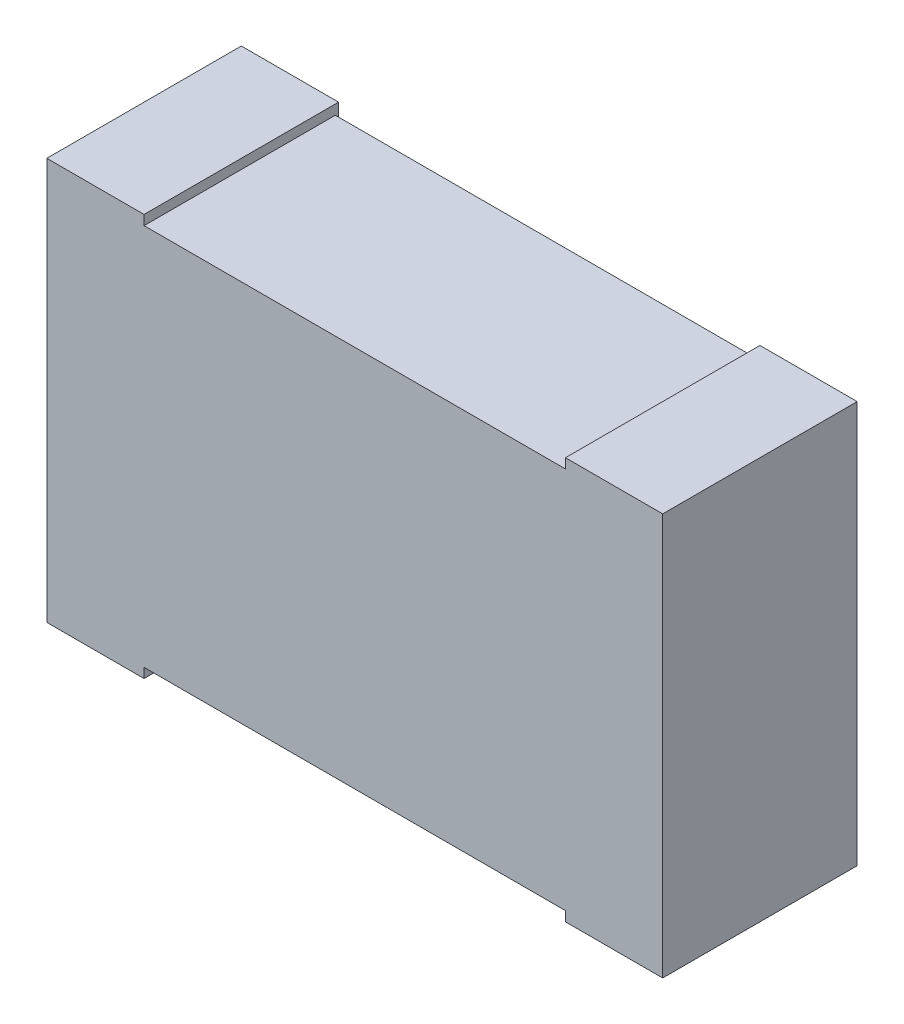
ISO-10303-21;
HEADER;
FILE_DESCRIPTION(('STEP AP214'),'2;1');
FILE_NAME('part.step','',(''),(''),'','','');
FILE_SCHEMA(('AUTOMOTIVE_DESIGN { 1 0 10303 214 1 1 1 1 }'));
ENDSEC;
DATA;
#1=APPLICATION_CONTEXT('core data for automotive mechanical design processes');
#2=APPLICATION_PROTOCOL_DEFINITION('international standard','automotive_design',2000,#1);
#3=PRODUCT_CONTEXT('',#1,'mechanical');
#4=PRODUCT('Part','Part','',(#3));
#5=PRODUCT_RELATED_PRODUCT_CATEGORY('part','',(#4));
#6=PRODUCT_DEFINITION_FORMATION('','',#4);
#7=PRODUCT_DEFINITION_CONTEXT('part definition',#1,'design');
#8=PRODUCT_DEFINITION('design','',#6,#7);
#9=PRODUCT_DEFINITION_SHAPE('','',#8);
#10=(LENGTH_UNIT() NAMED_UNIT(*) SI_UNIT(.MILLI.,.METRE.));
#11=(NAMED_UNIT(*) PLANE_ANGLE_UNIT() SI_UNIT($,.RADIAN.));
#12=(NAMED_UNIT(*) SI_UNIT($,.STERADIAN.) SOLID_ANGLE_UNIT());
#13=UNCERTAINTY_MEASURE_WITH_UNIT(LENGTH_MEASURE(1.E-05),#10,'distance_accuracy_value','');
#14=(GEOMETRIC_REPRESENTATION_CONTEXT(3) GLOBAL_UNCERTAINTY_ASSIGNED_CONTEXT((#13)) GLOBAL_UNIT_ASSIGNED_CONTEXT((#10,
#11,#12)) REPRESENTATION_CONTEXT('',''));
#15=CARTESIAN_POINT('',(0.,0.,0.));
#16=DIRECTION('',(0.,0.,1.));
#17=DIRECTION('',(1.,0.,0.));
#18=AXIS2_PLACEMENT_3D('',#15,#16,#17);
#19=CARTESIAN_POINT('',(-11.442010069563,-2.8790983561611,-0.6));
#20=DIRECTION('',(0.,0.,-1.));
#21=DIRECTION('',(-1.,0.,0.));
#22=AXIS2_PLACEMENT_3D('',#19,#20,#21);
#23=PLANE('',#22);
#24=DIRECTION('',(0.,1.,0.));
#25=VECTOR('',#24,1.);
#26=CARTESIAN_POINT('',(-12.392010069563,-3.4990983561611,-0.6));
#27=LINE('',#26,#25);
#28=CARTESIAN_POINT('',(-12.392010069563,-2.2590983561611,-0.6));
#29=VERTEX_POINT('',#28);
#30=CARTESIAN_POINT('',(-12.392010069563,-3.4990983561611,-0.6));
#31=VERTEX_POINT('',#30);
#32=EDGE_CURVE('E102',#29,#31,#27,.F.);
#33=ORIENTED_EDGE('',*,*,#32,.F.);
#34=DIRECTION('',(1.,0.,0.));
#35=VECTOR('',#34,1.);
#36=CARTESIAN_POINT('',(-12.392010069563,-2.2590983561611,-0.6));
#37=LINE('',#36,#35);
#38=CARTESIAN_POINT('',(-12.092010069563,-2.2590983561611,-0.6));
#39=VERTEX_POINT('',#38);
#40=EDGE_CURVE('E107',#39,#29,#37,.F.);
#41=ORIENTED_EDGE('',*,*,#40,.F.);
#42=DIRECTION('',(0.,1.,0.));
#43=VECTOR('',#42,1.);
#44=CARTESIAN_POINT('',(-12.092010069563,-3.4690983561611,-0.6));
#45=LINE('',#44,#43);
#46=CARTESIAN_POINT('',(-12.092010069563,-3.4990983561611,-0.6));
#47=VERTEX_POINT('',#46);
#48=EDGE_CURVE('E131',#47,#39,#45,.T.);
#49=ORIENTED_EDGE('',*,*,#48,.F.);
#50=DIRECTION('',(1.,0.,0.));
#51=VECTOR('',#50,1.);
#52=CARTESIAN_POINT('',(-12.092010069563,-3.4990983561611,-0.6));
#53=LINE('',#52,#51);
#54=EDGE_CURVE('E116',#31,#47,#53,.T.);
#55=ORIENTED_EDGE('',*,*,#54,.F.);
#56=EDGE_LOOP('',(#33,#41,#49,#55));
#57=FACE_BOUND('',#56,.T.);
#58=ADVANCED_FACE('F16',(#57),#23,.T.);
#59=CARTESIAN_POINT('',(-11.442010069563,-2.8790983561611,-0.59));
#60=DIRECTION('',(0.,0.,1.));
#61=DIRECTION('',(1.,0.,0.));
#62=AXIS2_PLACEMENT_3D('',#59,#60,#61);
#63=PLANE('',#62);
#64=DIRECTION('',(0.,1.,0.));
#65=VECTOR('',#64,1.);
#66=CARTESIAN_POINT('',(-10.792010069563,-3.4990983561611,-0.59));
#67=LINE('',#66,#65);
#68=CARTESIAN_POINT('',(-10.792010069563,-3.4690983561611,-0.59));
#69=VERTEX_POINT('',#68);
#70=CARTESIAN_POINT('',(-10.792010069563,-2.2890983561611,-0.59));
#71=VERTEX_POINT('',#70);
#72=EDGE_CURVE('E160',#69,#71,#67,.T.);
#73=ORIENTED_EDGE('',*,*,#72,.F.);
#74=DIRECTION('',(1.,0.,0.));
#75=VECTOR('',#74,1.);
#76=CARTESIAN_POINT('',(-10.792010069563,-3.4690983561611,-0.59));
#77=LINE('',#76,#75);
#78=CARTESIAN_POINT('',(-12.092010069563,-3.4690983561611,-0.59));
#79=VERTEX_POINT('',#78);
#80=EDGE_CURVE('E140',#79,#69,#77,.T.);
#81=ORIENTED_EDGE('',*,*,#80,.F.);
#82=DIRECTION('',(0.,1.,0.));
#83=VECTOR('',#82,1.);
#84=CARTESIAN_POINT('',(-12.092010069563,-3.4690983561611,-0.59));
#85=LINE('',#84,#83);
#86=CARTESIAN_POINT('',(-12.092010069563,-2.2890983561611,-0.59));
#87=VERTEX_POINT('',#86);
#88=EDGE_CURVE('E137',#87,#79,#85,.F.);
#89=ORIENTED_EDGE('',*,*,#88,.F.);
#90=DIRECTION('',(1.,0.,0.));
#91=VECTOR('',#90,1.);
#92=CARTESIAN_POINT('',(-12.092010069563,-2.2890983561611,-0.59));
#93=LINE('',#92,#91);
#94=EDGE_CURVE('E19',#71,#87,#93,.F.);
#95=ORIENTED_EDGE('',*,*,#94,.F.);
#96=EDGE_LOOP('',(#73,#81,#89,#95));
#97=FACE_BOUND('',#96,.T.);
#98=ADVANCED_FACE('F333',(#97),#63,.F.);
#99=CARTESIAN_POINT('',(-11.442010069563,-2.8790983561611,-0.6));
#100=DIRECTION('',(0.,0.,-1.));
#101=DIRECTION('',(-1.,0.,0.));
#102=AXIS2_PLACEMENT_3D('',#99,#100,#101);
#103=PLANE('',#102);
#104=DIRECTION('',(0.,1.,0.));
#105=VECTOR('',#104,1.);
#106=CARTESIAN_POINT('',(-10.492010069563,-2.2590983561611,-0.6));
#107=LINE('',#106,#105);
#108=CARTESIAN_POINT('',(-10.492010069563,-3.4990983561611,-0.6));
#109=VERTEX_POINT('',#108);
#110=CARTESIAN_POINT('',(-10.492010069563,-2.2590983561611,-0.6));
#111=VERTEX_POINT('',#110);
#112=EDGE_CURVE('E150',#109,#111,#107,.T.);
#113=ORIENTED_EDGE('',*,*,#112,.F.);
#114=DIRECTION('',(1.,0.,0.));
#115=VECTOR('',#114,1.);
#116=CARTESIAN_POINT('',(-10.492010069563,-3.4990983561611,-0.6));
#117=LINE('',#116,#115);
#118=CARTESIAN_POINT('',(-10.792010069563,-3.4990983561611,-0.6));
#119=VERTEX_POINT('',#118);
#120=EDGE_CURVE('E145',#119,#109,#117,.T.);
#121=ORIENTED_EDGE('',*,*,#120,.F.);
#122=DIRECTION('',(0.,1.,0.));
#123=VECTOR('',#122,1.);
#124=CARTESIAN_POINT('',(-10.792010069563,-3.4990983561611,-0.6));
#125=LINE('',#124,#123);
#126=CARTESIAN_POINT('',(-10.792010069563,-2.2590983561611,-0.6));
#127=VERTEX_POINT('',#126);
#128=EDGE_CURVE('E167',#127,#119,#125,.F.);
#129=ORIENTED_EDGE('',*,*,#128,.F.);
#130=DIRECTION('',(1.,0.,0.));
#131=VECTOR('',#130,1.);
#132=CARTESIAN_POINT('',(-10.792010069563,-2.2590983561611,-0.6));
#133=LINE('',#132,#131);
#134=EDGE_CURVE('E155',#111,#127,#133,.F.);
#135=ORIENTED_EDGE('',*,*,#134,.F.);
#136=EDGE_LOOP('',(#113,#121,#129,#135));
#137=FACE_BOUND('',#136,.T.);
#138=ADVANCED_FACE('F210',(#137),#103,.T.);
#139=CARTESIAN_POINT('',(-12.092010069563,-2.2890983561611,0.));
#140=DIRECTION('',(0.,1.,0.));
#141=DIRECTION('',(0.,0.,1.));
#142=AXIS2_PLACEMENT_3D('',#139,#140,#141);
#143=PLANE('',#142);
#144=DIRECTION('',(1.,0.,0.));
#145=VECTOR('',#144,1.);
#146=CARTESIAN_POINT('',(-11.442010069563,-2.2890983561611,0.));
#147=LINE('',#146,#145);
#148=CARTESIAN_POINT('',(-10.792010069563,-2.2890983561611,0.));
#149=VERTEX_POINT('',#148);
#150=CARTESIAN_POINT('',(-12.092010069563,-2.2890983561611,0.));
#151=VERTEX_POINT('',#150);
#152=EDGE_CURVE('E172',#149,#151,#147,.F.);
#153=ORIENTED_EDGE('',*,*,#152,.F.);
#154=DIRECTION('',(0.,0.,1.));
#155=VECTOR('',#154,1.);
#156=CARTESIAN_POINT('',(-10.792010069563,-2.2890983561611,0.));
#157=LINE('',#156,#155);
#158=EDGE_CURVE('E163',#71,#149,#157,.T.);
#159=ORIENTED_EDGE('',*,*,#158,.F.);
#160=ORIENTED_EDGE('',*,*,#94,.T.);
#161=DIRECTION('',(0.,0.,-1.));
#162=VECTOR('',#161,1.);
#163=CARTESIAN_POINT('',(-12.092010069563,-2.2890983561611,0.));
#164=LINE('',#163,#162);
#165=EDGE_CURVE('E134',#151,#87,#164,.T.);
#166=ORIENTED_EDGE('',*,*,#165,.F.);
#167=EDGE_LOOP('',(#153,#159,#160,#166));
#168=FACE_BOUND('',#167,.T.);
#169=ADVANCED_FACE('F217',(#168),#143,.T.);
#170=CARTESIAN_POINT('',(-12.392010069563,-2.2590983561611,0.));
#171=DIRECTION('',(0.,1.,0.));
#172=DIRECTION('',(0.,0.,1.));
#173=AXIS2_PLACEMENT_3D('',#170,#171,#172);
#174=PLANE('',#173);
#175=ORIENTED_EDGE('',*,*,#40,.T.);
#176=DIRECTION('',(0.,0.,1.));
#177=VECTOR('',#176,1.);
#178=CARTESIAN_POINT('',(-12.392010069563,-2.2590983561611,0.));
#179=LINE('',#178,#177);
#180=CARTESIAN_POINT('',(-12.392010069563,-2.2590983561611,0.));
#181=VERTEX_POINT('',#180);
#182=EDGE_CURVE('E110',#181,#29,#179,.F.);
#183=ORIENTED_EDGE('',*,*,#182,.F.);
#184=DIRECTION('',(1.,0.,0.));
#185=VECTOR('',#184,1.);
#186=CARTESIAN_POINT('',(-11.442010069563,-2.2590983561611,0.));
#187=LINE('',#186,#185);
#188=CARTESIAN_POINT('',(-12.092010069563,-2.2590983561611,0.));
#189=VERTEX_POINT('',#188);
#190=EDGE_CURVE('E178',#189,#181,#187,.F.);
#191=ORIENTED_EDGE('',*,*,#190,.F.);
#192=DIRECTION('',(0.,0.,-1.));
#193=VECTOR('',#192,1.);
#194=CARTESIAN_POINT('',(-12.092010069563,-2.2590983561611,0.));
#195=LINE('',#194,#193);
#196=EDGE_CURVE('E112',#39,#189,#195,.F.);
#197=ORIENTED_EDGE('',*,*,#196,.F.);
#198=EDGE_LOOP('',(#175,#183,#191,#197));
#199=FACE_BOUND('',#198,.T.);
#200=ADVANCED_FACE('F108',(#199),#174,.T.);
#201=CARTESIAN_POINT('',(-12.392010069563,-3.4990983561611,0.));
#202=DIRECTION('',(-1.,0.,0.));
#203=DIRECTION('',(0.,0.,1.));
#204=AXIS2_PLACEMENT_3D('',#201,#202,#203);
#205=PLANE('',#204);
#206=ORIENTED_EDGE('',*,*,#32,.T.);
#207=DIRECTION('',(0.,0.,-1.));
#208=VECTOR('',#207,1.);
#209=CARTESIAN_POINT('',(-12.392010069563,-3.4990983561611,0.));
#210=LINE('',#209,#208);
#211=CARTESIAN_POINT('',(-12.392010069563,-3.4990983561611,0.));
#212=VERTEX_POINT('',#211);
#213=EDGE_CURVE('E118',#212,#31,#210,.T.);
#214=ORIENTED_EDGE('',*,*,#213,.F.);
#215=DIRECTION('',(0.,1.,0.));
#216=VECTOR('',#215,1.);
#217=CARTESIAN_POINT('',(-12.392010069563,-2.8790983561611,0.));
#218=LINE('',#217,#216);
#219=EDGE_CURVE('E122',#181,#212,#218,.F.);
#220=ORIENTED_EDGE('',*,*,#219,.F.);
#221=ORIENTED_EDGE('',*,*,#182,.T.);
#222=EDGE_LOOP('',(#206,#214,#220,#221));
#223=FACE_BOUND('',#222,.T.);
#224=ADVANCED_FACE('F120',(#223),#205,.T.);
#225=CARTESIAN_POINT('',(-12.092010069563,-3.4990983561611,0.));
#226=DIRECTION('',(0.,-1.,0.));
#227=DIRECTION('',(0.,0.,-1.));
#228=AXIS2_PLACEMENT_3D('',#225,#226,#227);
#229=PLANE('',#228);
#230=ORIENTED_EDGE('',*,*,#54,.T.);
#231=DIRECTION('',(0.,0.,-1.));
#232=VECTOR('',#231,1.);
#233=CARTESIAN_POINT('',(-12.092010069563,-3.4990983561611,0.));
#234=LINE('',#233,#232);
#235=CARTESIAN_POINT('',(-12.092010069563,-3.4990983561611,0.));
#236=VERTEX_POINT('',#235);
#237=EDGE_CURVE('E128',#236,#47,#234,.T.);
#238=ORIENTED_EDGE('',*,*,#237,.F.);
#239=DIRECTION('',(1.,0.,0.));
#240=VECTOR('',#239,1.);
#241=CARTESIAN_POINT('',(-11.442010069563,-3.4990983561611,0.));
#242=LINE('',#241,#240);
#243=EDGE_CURVE('E181',#212,#236,#242,.T.);
#244=ORIENTED_EDGE('',*,*,#243,.F.);
#245=ORIENTED_EDGE('',*,*,#213,.T.);
#246=EDGE_LOOP('',(#230,#238,#244,#245));
#247=FACE_BOUND('',#246,.T.);
#248=ADVANCED_FACE('F225',(#247),#229,.T.);
#249=CARTESIAN_POINT('',(-12.092010069563,-3.4690983561611,0.));
#250=DIRECTION('',(1.,0.,0.));
#251=DIRECTION('',(0.,0.,-1.));
#252=AXIS2_PLACEMENT_3D('',#249,#250,#251);
#253=PLANE('',#252);
#254=ORIENTED_EDGE('',*,*,#88,.T.);
#255=DIRECTION('',(0.,0.,-1.));
#256=VECTOR('',#255,1.);
#257=CARTESIAN_POINT('',(-12.092010069563,-3.4690983561611,0.));
#258=LINE('',#257,#256);
#259=CARTESIAN_POINT('',(-12.092010069563,-3.4690983561611,0.));
#260=VERTEX_POINT('',#259);
#261=EDGE_CURVE('E142',#260,#79,#258,.T.);
#262=ORIENTED_EDGE('',*,*,#261,.F.);
#263=DIRECTION('',(0.,1.,0.));
#264=VECTOR('',#263,1.);
#265=CARTESIAN_POINT('',(-12.092010069563,-2.8790983561611,0.));
#266=LINE('',#265,#264);
#267=EDGE_CURVE('E184',#236,#260,#266,.T.);
#268=ORIENTED_EDGE('',*,*,#267,.F.);
#269=ORIENTED_EDGE('',*,*,#237,.T.);
#270=ORIENTED_EDGE('',*,*,#48,.T.);
#271=ORIENTED_EDGE('',*,*,#196,.T.);
#272=DIRECTION('',(0.,1.,0.));
#273=VECTOR('',#272,1.);
#274=CARTESIAN_POINT('',(-12.092010069563,-2.8790983561611,0.));
#275=LINE('',#274,#273);
#276=EDGE_CURVE('E175',#151,#189,#275,.T.);
#277=ORIENTED_EDGE('',*,*,#276,.F.);
#278=ORIENTED_EDGE('',*,*,#165,.T.);
#279=EDGE_LOOP('',(#254,#262,#268,#269,#270,#271,#277,#278));
#280=FACE_BOUND('',#279,.T.);
#281=ADVANCED_FACE('F221',(#280),#253,.T.);
#282=CARTESIAN_POINT('',(-10.792010069563,-3.4690983561611,0.));
#283=DIRECTION('',(0.,-1.,0.));
#284=DIRECTION('',(0.,0.,-1.));
#285=AXIS2_PLACEMENT_3D('',#282,#283,#284);
#286=PLANE('',#285);
#287=DIRECTION('',(1.,0.,0.));
#288=VECTOR('',#287,1.);
#289=CARTESIAN_POINT('',(-11.442010069563,-3.4690983561611,0.));
#290=LINE('',#289,#288);
#291=CARTESIAN_POINT('',(-10.792010069563,-3.4690983561611,0.));
#292=VERTEX_POINT('',#291);
#293=EDGE_CURVE('E187',#260,#292,#290,.T.);
#294=ORIENTED_EDGE('',*,*,#293,.F.);
#295=ORIENTED_EDGE('',*,*,#261,.T.);
#296=ORIENTED_EDGE('',*,*,#80,.T.);
#297=DIRECTION('',(0.,0.,1.));
#298=VECTOR('',#297,1.);
#299=CARTESIAN_POINT('',(-10.792010069563,-3.4690983561611,0.));
#300=LINE('',#299,#298);
#301=EDGE_CURVE('E157',#292,#69,#300,.F.);
#302=ORIENTED_EDGE('',*,*,#301,.F.);
#303=EDGE_LOOP('',(#294,#295,#296,#302));
#304=FACE_BOUND('',#303,.T.);
#305=ADVANCED_FACE('F229',(#304),#286,.T.);
#306=CARTESIAN_POINT('',(-10.492010069563,-3.4990983561611,0.));
#307=DIRECTION('',(0.,-1.,0.));
#308=DIRECTION('',(0.,0.,-1.));
#309=AXIS2_PLACEMENT_3D('',#306,#307,#308);
#310=PLANE('',#309);
#311=ORIENTED_EDGE('',*,*,#120,.T.);
#312=DIRECTION('',(0.,0.,-1.));
#313=VECTOR('',#312,1.);
#314=CARTESIAN_POINT('',(-10.492010069563,-3.4990983561611,0.));
#315=LINE('',#314,#313);
#316=CARTESIAN_POINT('',(-10.492010069563,-3.4990983561611,0.));
#317=VERTEX_POINT('',#316);
#318=EDGE_CURVE('E147',#317,#109,#315,.T.);
#319=ORIENTED_EDGE('',*,*,#318,.F.);
#320=DIRECTION('',(1.,0.,0.));
#321=VECTOR('',#320,1.);
#322=CARTESIAN_POINT('',(-11.442010069563,-3.4990983561611,0.));
#323=LINE('',#322,#321);
#324=CARTESIAN_POINT('',(-10.792010069563,-3.4990983561611,0.));
#325=VERTEX_POINT('',#324);
#326=EDGE_CURVE('E193',#325,#317,#323,.T.);
#327=ORIENTED_EDGE('',*,*,#326,.F.);
#328=DIRECTION('',(0.,0.,1.));
#329=VECTOR('',#328,1.);
#330=CARTESIAN_POINT('',(-10.792010069563,-3.4990983561611,0.));
#331=LINE('',#330,#329);
#332=EDGE_CURVE('E170',#119,#325,#331,.T.);
#333=ORIENTED_EDGE('',*,*,#332,.F.);
#334=EDGE_LOOP('',(#311,#319,#327,#333));
#335=FACE_BOUND('',#334,.T.);
#336=ADVANCED_FACE('F232',(#335),#310,.T.);
#337=CARTESIAN_POINT('',(-10.492010069563,-2.2590983561611,0.));
#338=DIRECTION('',(1.,0.,0.));
#339=DIRECTION('',(0.,0.,-1.));
#340=AXIS2_PLACEMENT_3D('',#337,#338,#339);
#341=PLANE('',#340);
#342=ORIENTED_EDGE('',*,*,#112,.T.);
#343=DIRECTION('',(0.,0.,1.));
#344=VECTOR('',#343,1.);
#345=CARTESIAN_POINT('',(-10.492010069563,-2.2590983561611,0.));
#346=LINE('',#345,#344);
#347=CARTESIAN_POINT('',(-10.492010069563,-2.2590983561611,0.));
#348=VERTEX_POINT('',#347);
#349=EDGE_CURVE('E152',#348,#111,#346,.F.);
#350=ORIENTED_EDGE('',*,*,#349,.F.);
#351=DIRECTION('',(0.,1.,0.));
#352=VECTOR('',#351,1.);
#353=CARTESIAN_POINT('',(-10.492010069563,-2.8790983561611,0.));
#354=LINE('',#353,#352);
#355=EDGE_CURVE('E196',#317,#348,#354,.T.);
#356=ORIENTED_EDGE('',*,*,#355,.F.);
#357=ORIENTED_EDGE('',*,*,#318,.T.);
#358=EDGE_LOOP('',(#342,#350,#356,#357));
#359=FACE_BOUND('',#358,.T.);
#360=ADVANCED_FACE('F207',(#359),#341,.T.);
#361=CARTESIAN_POINT('',(-10.792010069563,-2.2590983561611,0.));
#362=DIRECTION('',(0.,1.,0.));
#363=DIRECTION('',(0.,0.,1.));
#364=AXIS2_PLACEMENT_3D('',#361,#362,#363);
#365=PLANE('',#364);
#366=ORIENTED_EDGE('',*,*,#134,.T.);
#367=DIRECTION('',(0.,0.,1.));
#368=VECTOR('',#367,1.);
#369=CARTESIAN_POINT('',(-10.792010069563,-2.2590983561611,0.));
#370=LINE('',#369,#368);
#371=CARTESIAN_POINT('',(-10.792010069563,-2.2590983561611,0.));
#372=VERTEX_POINT('',#371);
#373=EDGE_CURVE('E34',#372,#127,#370,.F.);
#374=ORIENTED_EDGE('',*,*,#373,.F.);
#375=DIRECTION('',(1.,0.,0.));
#376=VECTOR('',#375,1.);
#377=CARTESIAN_POINT('',(-11.442010069563,-2.2590983561611,0.));
#378=LINE('',#377,#376);
#379=EDGE_CURVE('E25',#348,#372,#378,.F.);
#380=ORIENTED_EDGE('',*,*,#379,.F.);
#381=ORIENTED_EDGE('',*,*,#349,.T.);
#382=EDGE_LOOP('',(#366,#374,#380,#381));
#383=FACE_BOUND('',#382,.T.);
#384=ADVANCED_FACE('F203',(#383),#365,.T.);
#385=CARTESIAN_POINT('',(-10.792010069563,-3.4990983561611,0.));
#386=DIRECTION('',(-1.,0.,0.));
#387=DIRECTION('',(0.,0.,1.));
#388=AXIS2_PLACEMENT_3D('',#385,#386,#387);
#389=PLANE('',#388);
#390=ORIENTED_EDGE('',*,*,#128,.T.);
#391=ORIENTED_EDGE('',*,*,#332,.T.);
#392=DIRECTION('',(0.,1.,0.));
#393=VECTOR('',#392,1.);
#394=CARTESIAN_POINT('',(-10.792010069563,-2.8790983561611,0.));
#395=LINE('',#394,#393);
#396=EDGE_CURVE('E190',#292,#325,#395,.F.);
#397=ORIENTED_EDGE('',*,*,#396,.F.);
#398=ORIENTED_EDGE('',*,*,#301,.T.);
#399=ORIENTED_EDGE('',*,*,#72,.T.);
#400=ORIENTED_EDGE('',*,*,#158,.T.);
#401=DIRECTION('',(0.,1.,0.));
#402=VECTOR('',#401,1.);
#403=CARTESIAN_POINT('',(-10.792010069563,-2.8790983561611,0.));
#404=LINE('',#403,#402);
#405=EDGE_CURVE('E11',#372,#149,#404,.F.);
#406=ORIENTED_EDGE('',*,*,#405,.F.);
#407=ORIENTED_EDGE('',*,*,#373,.T.);
#408=EDGE_LOOP('',(#390,#391,#397,#398,#399,#400,#406,#407));
#409=FACE_BOUND('',#408,.T.);
#410=ADVANCED_FACE('F213',(#409),#389,.T.);
#411=CARTESIAN_POINT('',(-11.442010069563,-2.8790983561611,0.));
#412=DIRECTION('',(0.,0.,1.));
#413=DIRECTION('',(1.,0.,0.));
#414=AXIS2_PLACEMENT_3D('',#411,#412,#413);
#415=PLANE('',#414);
#416=ORIENTED_EDGE('',*,*,#379,.T.);
#417=ORIENTED_EDGE('',*,*,#405,.T.);
#418=ORIENTED_EDGE('',*,*,#152,.T.);
#419=ORIENTED_EDGE('',*,*,#276,.T.);
#420=ORIENTED_EDGE('',*,*,#190,.T.);
#421=ORIENTED_EDGE('',*,*,#219,.T.);
#422=ORIENTED_EDGE('',*,*,#243,.T.);
#423=ORIENTED_EDGE('',*,*,#267,.T.);
#424=ORIENTED_EDGE('',*,*,#293,.T.);
#425=ORIENTED_EDGE('',*,*,#396,.T.);
#426=ORIENTED_EDGE('',*,*,#326,.T.);
#427=ORIENTED_EDGE('',*,*,#355,.T.);
#428=EDGE_LOOP('',(#416,#417,#418,#419,#420,#421,#422,#423,#424,#425,#426,#427));
#429=FACE_BOUND('',#428,.T.);
#430=ADVANCED_FACE('F201',(#429),#415,.T.);
#431=CLOSED_SHELL('',(#58,#98,#138,#169,#200,#224,#248,#281,#305,#336,#360,#384,#410,#430));
#432=MANIFOLD_SOLID_BREP('B1',#431);
#433=ADVANCED_BREP_SHAPE_REPRESENTATION('',(#18,#432),#14);
#434=SHAPE_DEFINITION_REPRESENTATION(#9,#433);
ENDSEC;
END-ISO-10303-21;
